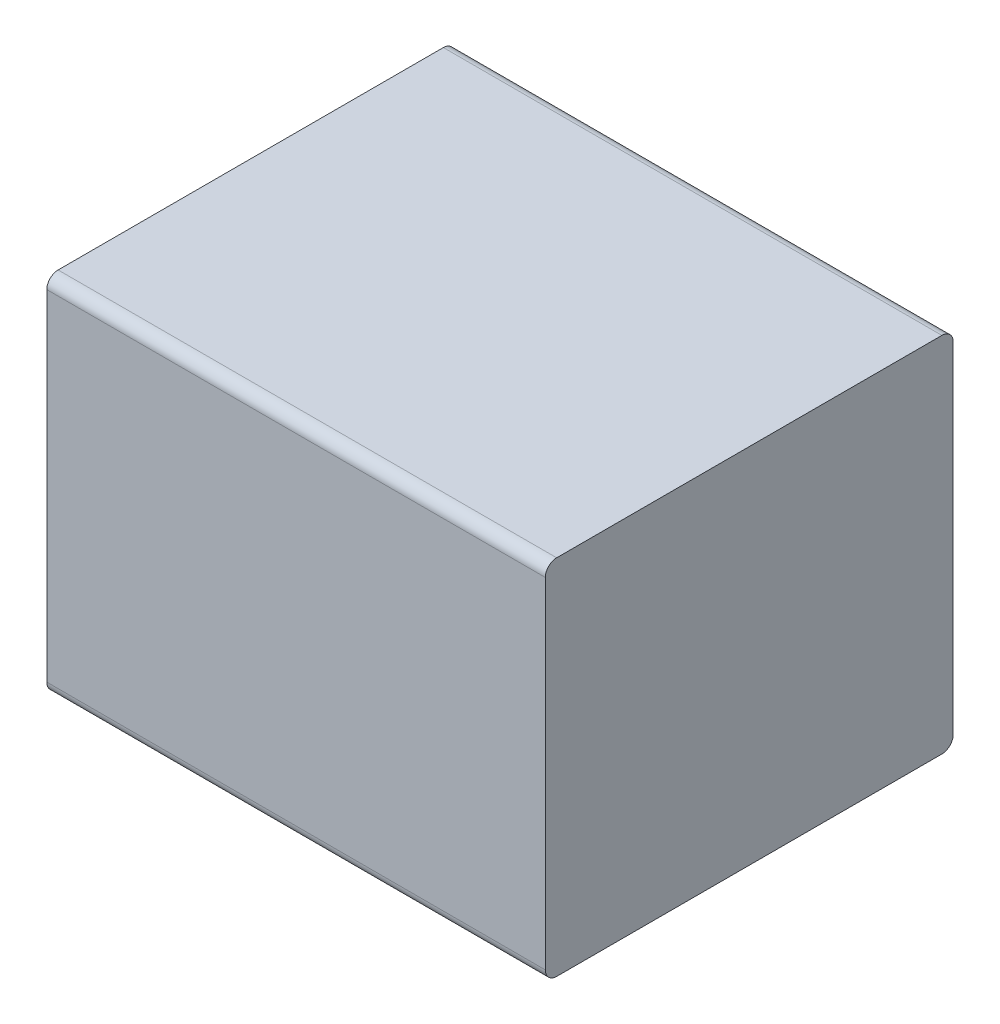
ISO-10303-21;
HEADER;
FILE_DESCRIPTION(('STEP AP214'),'2;1');
FILE_NAME('part.step','',(''),(''),'','','');
FILE_SCHEMA(('AUTOMOTIVE_DESIGN { 1 0 10303 214 1 1 1 1 }'));
ENDSEC;
DATA;
#1=APPLICATION_CONTEXT('core data for automotive mechanical design processes');
#2=APPLICATION_PROTOCOL_DEFINITION('international standard','automotive_design',2000,#1);
#3=PRODUCT_CONTEXT('',#1,'mechanical');
#4=PRODUCT('Part','Part','',(#3));
#5=PRODUCT_RELATED_PRODUCT_CATEGORY('part','',(#4));
#6=PRODUCT_DEFINITION_FORMATION('','',#4);
#7=PRODUCT_DEFINITION_CONTEXT('part definition',#1,'design');
#8=PRODUCT_DEFINITION('design','',#6,#7);
#9=PRODUCT_DEFINITION_SHAPE('','',#8);
#10=(LENGTH_UNIT() NAMED_UNIT(*) SI_UNIT(.MILLI.,.METRE.));
#11=(NAMED_UNIT(*) PLANE_ANGLE_UNIT() SI_UNIT($,.RADIAN.));
#12=(NAMED_UNIT(*) SI_UNIT($,.STERADIAN.) SOLID_ANGLE_UNIT());
#13=UNCERTAINTY_MEASURE_WITH_UNIT(LENGTH_MEASURE(1.E-05),#10,'distance_accuracy_value','');
#14=(GEOMETRIC_REPRESENTATION_CONTEXT(3) GLOBAL_UNCERTAINTY_ASSIGNED_CONTEXT((#13)) GLOBAL_UNIT_ASSIGNED_CONTEXT((#10,
#11,#12)) REPRESENTATION_CONTEXT('',''));
#15=CARTESIAN_POINT('',(0.,0.,0.));
#16=DIRECTION('',(0.,0.,1.));
#17=DIRECTION('',(1.,0.,0.));
#18=AXIS2_PLACEMENT_3D('',#15,#16,#17);
#19=CARTESIAN_POINT('',(0.,-0.75,1.76));
#20=DIRECTION('',(-1.,0.,0.));
#21=DIRECTION('',(0.,-1.,0.));
#22=AXIS2_PLACEMENT_3D('',#19,#20,#21);
#23=CYLINDRICAL_SURFACE('',#22,0.05);
#24=DIRECTION('',(1.,0.,0.));
#25=VECTOR('',#24,1.);
#26=CARTESIAN_POINT('',(0.,-0.75,1.81));
#27=LINE('',#26,#25);
#28=CARTESIAN_POINT('',(-1.1,-0.75,1.81));
#29=VERTEX_POINT('',#28);
#30=CARTESIAN_POINT('',(1.1,-0.75,1.81));
#31=VERTEX_POINT('',#30);
#32=EDGE_CURVE('E11',#29,#31,#27,.T.);
#33=ORIENTED_EDGE('',*,*,#32,.F.);
#34=CARTESIAN_POINT('',(-1.1,-0.75,1.76));
#35=DIRECTION('',(-1.,0.,0.));
#36=DIRECTION('',(0.,0.,-1.));
#37=AXIS2_PLACEMENT_3D('',#34,#35,#36);
#38=CIRCLE('',#37,0.0499999999999999);
#39=CARTESIAN_POINT('',(-1.1,-0.8,1.76));
#40=VERTEX_POINT('',#39);
#41=EDGE_CURVE('E24',#40,#29,#38,.T.);
#42=ORIENTED_EDGE('',*,*,#41,.F.);
#43=DIRECTION('',(-1.,0.,0.));
#44=VECTOR('',#43,1.);
#45=CARTESIAN_POINT('',(0.,-0.8,1.76));
#46=LINE('',#45,#44);
#47=CARTESIAN_POINT('',(1.1,-0.8,1.76));
#48=VERTEX_POINT('',#47);
#49=EDGE_CURVE('E137',#48,#40,#46,.T.);
#50=ORIENTED_EDGE('',*,*,#49,.F.);
#51=CARTESIAN_POINT('',(1.1,-0.75,1.76));
#52=DIRECTION('',(1.,0.,0.));
#53=DIRECTION('',(0.,0.,1.));
#54=AXIS2_PLACEMENT_3D('',#51,#52,#53);
#55=CIRCLE('',#54,0.0499999999999999);
#56=EDGE_CURVE('E134',#31,#48,#55,.T.);
#57=ORIENTED_EDGE('',*,*,#56,.F.);
#58=EDGE_LOOP('',(#33,#42,#50,#57));
#59=FACE_BOUND('',#58,.T.);
#60=ADVANCED_FACE('F17',(#59),#23,.T.);
#61=CARTESIAN_POINT('',(1.1,-0.75,0.0599999999999999));
#62=DIRECTION('',(1.,0.,0.));
#63=DIRECTION('',(0.,1.,0.));
#64=AXIS2_PLACEMENT_3D('',#61,#62,#63);
#65=CYLINDRICAL_SURFACE('',#64,0.05);
#66=DIRECTION('',(1.,0.,0.));
#67=VECTOR('',#66,1.);
#68=CARTESIAN_POINT('',(1.1,-0.8,0.0599999999999999));
#69=LINE('',#68,#67);
#70=CARTESIAN_POINT('',(-1.1,-0.8,0.0600000000000002));
#71=VERTEX_POINT('',#70);
#72=CARTESIAN_POINT('',(1.1,-0.8,0.0600000000000002));
#73=VERTEX_POINT('',#72);
#74=EDGE_CURVE('E132',#71,#73,#69,.T.);
#75=ORIENTED_EDGE('',*,*,#74,.F.);
#76=CARTESIAN_POINT('',(-1.1,-0.75,0.0599999999999999));
#77=DIRECTION('',(-1.,0.,0.));
#78=DIRECTION('',(0.,0.,-1.));
#79=AXIS2_PLACEMENT_3D('',#76,#77,#78);
#80=CIRCLE('',#79,0.05);
#81=CARTESIAN_POINT('',(-1.1,-0.75,0.01));
#82=VERTEX_POINT('',#81);
#83=EDGE_CURVE('E129',#82,#71,#80,.T.);
#84=ORIENTED_EDGE('',*,*,#83,.F.);
#85=DIRECTION('',(-1.,0.,0.));
#86=VECTOR('',#85,1.);
#87=CARTESIAN_POINT('',(0.,-0.75,0.01));
#88=LINE('',#87,#86);
#89=CARTESIAN_POINT('',(1.1,-0.75,0.01));
#90=VERTEX_POINT('',#89);
#91=EDGE_CURVE('E126',#90,#82,#88,.T.);
#92=ORIENTED_EDGE('',*,*,#91,.F.);
#93=CARTESIAN_POINT('',(1.1,-0.75,0.0599999999999999));
#94=DIRECTION('',(1.,0.,0.));
#95=DIRECTION('',(0.,0.,1.));
#96=AXIS2_PLACEMENT_3D('',#93,#94,#95);
#97=CIRCLE('',#96,0.05);
#98=EDGE_CURVE('E123',#73,#90,#97,.T.);
#99=ORIENTED_EDGE('',*,*,#98,.F.);
#100=EDGE_LOOP('',(#75,#84,#92,#99));
#101=FACE_BOUND('',#100,.T.);
#102=ADVANCED_FACE('F158',(#101),#65,.T.);
#103=CARTESIAN_POINT('',(0.,0.75,0.06));
#104=DIRECTION('',(1.,0.,0.));
#105=DIRECTION('',(0.,1.,0.));
#106=AXIS2_PLACEMENT_3D('',#103,#104,#105);
#107=CYLINDRICAL_SURFACE('',#106,0.05);
#108=DIRECTION('',(1.,0.,0.));
#109=VECTOR('',#108,1.);
#110=CARTESIAN_POINT('',(0.,0.75,0.01));
#111=LINE('',#110,#109);
#112=CARTESIAN_POINT('',(-1.1,0.75,0.01));
#113=VERTEX_POINT('',#112);
#114=CARTESIAN_POINT('',(1.1,0.75,0.01));
#115=VERTEX_POINT('',#114);
#116=EDGE_CURVE('E121',#113,#115,#111,.T.);
#117=ORIENTED_EDGE('',*,*,#116,.F.);
#118=CARTESIAN_POINT('',(-1.1,0.75,0.06));
#119=DIRECTION('',(-1.,0.,0.));
#120=DIRECTION('',(0.,0.,-1.));
#121=AXIS2_PLACEMENT_3D('',#118,#119,#120);
#122=CIRCLE('',#121,0.05);
#123=CARTESIAN_POINT('',(-1.1,0.8,0.0600000000000002));
#124=VERTEX_POINT('',#123);
#125=EDGE_CURVE('E119',#124,#113,#122,.T.);
#126=ORIENTED_EDGE('',*,*,#125,.F.);
#127=DIRECTION('',(-1.,0.,0.));
#128=VECTOR('',#127,1.);
#129=CARTESIAN_POINT('',(1.1,0.8,0.0599999999999999));
#130=LINE('',#129,#128);
#131=CARTESIAN_POINT('',(1.1,0.8,0.0600000000000002));
#132=VERTEX_POINT('',#131);
#133=EDGE_CURVE('E101',#132,#124,#130,.T.);
#134=ORIENTED_EDGE('',*,*,#133,.F.);
#135=CARTESIAN_POINT('',(1.1,0.75,0.06));
#136=DIRECTION('',(1.,0.,0.));
#137=DIRECTION('',(0.,0.,1.));
#138=AXIS2_PLACEMENT_3D('',#135,#136,#137);
#139=CIRCLE('',#138,0.05);
#140=EDGE_CURVE('E115',#115,#132,#139,.T.);
#141=ORIENTED_EDGE('',*,*,#140,.F.);
#142=EDGE_LOOP('',(#117,#126,#134,#141));
#143=FACE_BOUND('',#142,.T.);
#144=ADVANCED_FACE('F163',(#143),#107,.T.);
#145=CARTESIAN_POINT('',(0.,0.75,1.76));
#146=DIRECTION('',(1.,0.,0.));
#147=DIRECTION('',(0.,1.,0.));
#148=AXIS2_PLACEMENT_3D('',#145,#146,#147);
#149=CYLINDRICAL_SURFACE('',#148,0.05);
#150=DIRECTION('',(-1.,0.,0.));
#151=VECTOR('',#150,1.);
#152=CARTESIAN_POINT('',(0.,0.75,1.81));
#153=LINE('',#152,#151);
#154=CARTESIAN_POINT('',(1.1,0.75,1.81));
#155=VERTEX_POINT('',#154);
#156=CARTESIAN_POINT('',(-1.1,0.75,1.81));
#157=VERTEX_POINT('',#156);
#158=EDGE_CURVE('E113',#155,#157,#153,.T.);
#159=ORIENTED_EDGE('',*,*,#158,.F.);
#160=CARTESIAN_POINT('',(1.1,0.75,1.76));
#161=DIRECTION('',(1.,0.,0.));
#162=DIRECTION('',(0.,0.,1.));
#163=AXIS2_PLACEMENT_3D('',#160,#161,#162);
#164=CIRCLE('',#163,0.0499999999999999);
#165=CARTESIAN_POINT('',(1.1,0.8,1.76));
#166=VERTEX_POINT('',#165);
#167=EDGE_CURVE('E84',#166,#155,#164,.T.);
#168=ORIENTED_EDGE('',*,*,#167,.F.);
#169=DIRECTION('',(1.,0.,0.));
#170=VECTOR('',#169,1.);
#171=CARTESIAN_POINT('',(0.,0.8,1.76));
#172=LINE('',#171,#170);
#173=CARTESIAN_POINT('',(-1.1,0.8,1.76));
#174=VERTEX_POINT('',#173);
#175=EDGE_CURVE('E78',#174,#166,#172,.T.);
#176=ORIENTED_EDGE('',*,*,#175,.F.);
#177=CARTESIAN_POINT('',(-1.1,0.75,1.76));
#178=DIRECTION('',(-1.,0.,0.));
#179=DIRECTION('',(0.,0.,-1.));
#180=AXIS2_PLACEMENT_3D('',#177,#178,#179);
#181=CIRCLE('',#180,0.0499999999999999);
#182=EDGE_CURVE('E81',#157,#174,#181,.T.);
#183=ORIENTED_EDGE('',*,*,#182,.F.);
#184=EDGE_LOOP('',(#159,#168,#176,#183));
#185=FACE_BOUND('',#184,.T.);
#186=ADVANCED_FACE('F80',(#185),#149,.T.);
#187=CARTESIAN_POINT('',(-1.1,-0.8,1.81));
#188=DIRECTION('',(1.,0.,0.));
#189=DIRECTION('',(0.,0.,-1.));
#190=AXIS2_PLACEMENT_3D('',#187,#188,#189);
#191=PLANE('',#190);
#192=DIRECTION('',(0.,0.,-1.));
#193=VECTOR('',#192,1.);
#194=CARTESIAN_POINT('',(-1.1,-0.8,1.81));
#195=LINE('',#194,#193);
#196=EDGE_CURVE('E97',#40,#71,#195,.T.);
#197=ORIENTED_EDGE('',*,*,#196,.F.);
#198=ORIENTED_EDGE('',*,*,#41,.T.);
#199=DIRECTION('',(0.,-1.,0.));
#200=VECTOR('',#199,1.);
#201=CARTESIAN_POINT('',(-1.1,-0.8,1.81));
#202=LINE('',#201,#200);
#203=EDGE_CURVE('E96',#157,#29,#202,.T.);
#204=ORIENTED_EDGE('',*,*,#203,.F.);
#205=ORIENTED_EDGE('',*,*,#182,.T.);
#206=DIRECTION('',(0.,0.,-1.));
#207=VECTOR('',#206,1.);
#208=CARTESIAN_POINT('',(-1.1,0.8,1.81));
#209=LINE('',#208,#207);
#210=EDGE_CURVE('E95',#174,#124,#209,.T.);
#211=ORIENTED_EDGE('',*,*,#210,.T.);
#212=ORIENTED_EDGE('',*,*,#125,.T.);
#213=DIRECTION('',(0.,-1.,0.));
#214=VECTOR('',#213,1.);
#215=CARTESIAN_POINT('',(-1.1,-0.8,0.01));
#216=LINE('',#215,#214);
#217=EDGE_CURVE('E102',#113,#82,#216,.T.);
#218=ORIENTED_EDGE('',*,*,#217,.T.);
#219=ORIENTED_EDGE('',*,*,#83,.T.);
#220=EDGE_LOOP('',(#197,#198,#204,#205,#211,#212,#218,#219));
#221=FACE_BOUND('',#220,.T.);
#222=ADVANCED_FACE('F93',(#221),#191,.F.);
#223=CARTESIAN_POINT('',(1.1,-0.8,1.81));
#224=DIRECTION('',(0.,1.,0.));
#225=DIRECTION('',(-1.,0.,0.));
#226=AXIS2_PLACEMENT_3D('',#223,#224,#225);
#227=PLANE('',#226);
#228=DIRECTION('',(0.,0.,-1.));
#229=VECTOR('',#228,1.);
#230=CARTESIAN_POINT('',(1.1,-0.8,1.81));
#231=LINE('',#230,#229);
#232=EDGE_CURVE('E106',#48,#73,#231,.T.);
#233=ORIENTED_EDGE('',*,*,#232,.F.);
#234=ORIENTED_EDGE('',*,*,#49,.T.);
#235=ORIENTED_EDGE('',*,*,#196,.T.);
#236=ORIENTED_EDGE('',*,*,#74,.T.);
#237=EDGE_LOOP('',(#233,#234,#235,#236));
#238=FACE_BOUND('',#237,.T.);
#239=ADVANCED_FACE('F156',(#238),#227,.F.);
#240=CARTESIAN_POINT('',(1.1,-0.8,1.81));
#241=DIRECTION('',(-1.,0.,0.));
#242=DIRECTION('',(0.,0.,1.));
#243=AXIS2_PLACEMENT_3D('',#240,#241,#242);
#244=PLANE('',#243);
#245=DIRECTION('',(0.,1.,0.));
#246=VECTOR('',#245,1.);
#247=CARTESIAN_POINT('',(1.1,-0.8,1.81));
#248=LINE('',#247,#246);
#249=EDGE_CURVE('E141',#31,#155,#248,.T.);
#250=ORIENTED_EDGE('',*,*,#249,.F.);
#251=ORIENTED_EDGE('',*,*,#56,.T.);
#252=ORIENTED_EDGE('',*,*,#232,.T.);
#253=ORIENTED_EDGE('',*,*,#98,.T.);
#254=DIRECTION('',(0.,1.,0.));
#255=VECTOR('',#254,1.);
#256=CARTESIAN_POINT('',(1.1,-0.8,0.01));
#257=LINE('',#256,#255);
#258=EDGE_CURVE('E147',#90,#115,#257,.T.);
#259=ORIENTED_EDGE('',*,*,#258,.T.);
#260=ORIENTED_EDGE('',*,*,#140,.T.);
#261=DIRECTION('',(0.,0.,-1.));
#262=VECTOR('',#261,1.);
#263=CARTESIAN_POINT('',(1.1,0.8,1.81));
#264=LINE('',#263,#262);
#265=EDGE_CURVE('E144',#166,#132,#264,.T.);
#266=ORIENTED_EDGE('',*,*,#265,.F.);
#267=ORIENTED_EDGE('',*,*,#167,.T.);
#268=EDGE_LOOP('',(#250,#251,#252,#253,#259,#260,#266,#267));
#269=FACE_BOUND('',#268,.T.);
#270=ADVANCED_FACE('F143',(#269),#244,.F.);
#271=CARTESIAN_POINT('',(1.1,0.8,1.81));
#272=DIRECTION('',(0.,-1.,0.));
#273=DIRECTION('',(1.,0.,0.));
#274=AXIS2_PLACEMENT_3D('',#271,#272,#273);
#275=PLANE('',#274);
#276=ORIENTED_EDGE('',*,*,#265,.T.);
#277=ORIENTED_EDGE('',*,*,#133,.T.);
#278=ORIENTED_EDGE('',*,*,#210,.F.);
#279=ORIENTED_EDGE('',*,*,#175,.T.);
#280=EDGE_LOOP('',(#276,#277,#278,#279));
#281=FACE_BOUND('',#280,.T.);
#282=ADVANCED_FACE('F100',(#281),#275,.F.);
#283=CARTESIAN_POINT('',(0.,0.,1.81));
#284=DIRECTION('',(0.,0.,1.));
#285=DIRECTION('',(1.,0.,0.));
#286=AXIS2_PLACEMENT_3D('',#283,#284,#285);
#287=PLANE('',#286);
#288=ORIENTED_EDGE('',*,*,#203,.T.);
#289=ORIENTED_EDGE('',*,*,#32,.T.);
#290=ORIENTED_EDGE('',*,*,#249,.T.);
#291=ORIENTED_EDGE('',*,*,#158,.T.);
#292=EDGE_LOOP('',(#288,#289,#290,#291));
#293=FACE_BOUND('',#292,.T.);
#294=ADVANCED_FACE('F139',(#293),#287,.T.);
#295=CARTESIAN_POINT('',(0.,0.,0.01));
#296=DIRECTION('',(0.,0.,1.));
#297=DIRECTION('',(1.,0.,0.));
#298=AXIS2_PLACEMENT_3D('',#295,#296,#297);
#299=PLANE('',#298);
#300=ORIENTED_EDGE('',*,*,#258,.F.);
#301=ORIENTED_EDGE('',*,*,#91,.T.);
#302=ORIENTED_EDGE('',*,*,#217,.F.);
#303=ORIENTED_EDGE('',*,*,#116,.T.);
#304=EDGE_LOOP('',(#300,#301,#302,#303));
#305=FACE_BOUND('',#304,.T.);
#306=ADVANCED_FACE('F161',(#305),#299,.F.);
#307=CLOSED_SHELL('',(#60,#102,#144,#186,#222,#239,#270,#282,#294,#306));
#308=MANIFOLD_SOLID_BREP('B1',#307);
#309=ADVANCED_BREP_SHAPE_REPRESENTATION('',(#18,#308),#14);
#310=SHAPE_DEFINITION_REPRESENTATION(#9,#309);
ENDSEC;
END-ISO-10303-21;
